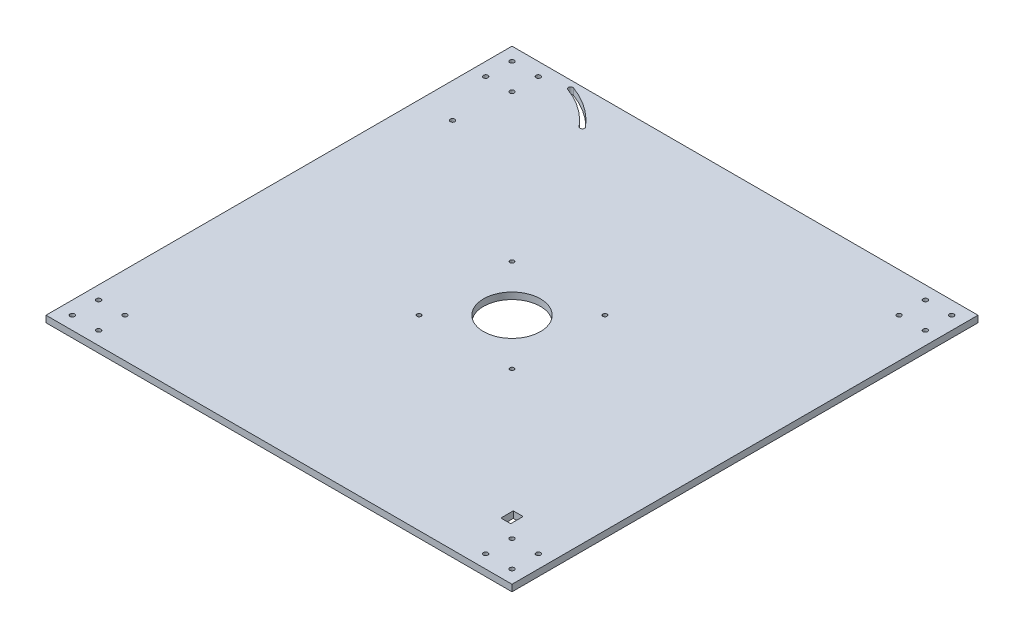
ISO-10303-21;
HEADER;
FILE_DESCRIPTION(('STEP AP214'),'2;1');
FILE_NAME('part.step','',(''),(''),'','','');
FILE_SCHEMA(('AUTOMOTIVE_DESIGN { 1 0 10303 214 1 1 1 1 }'));
ENDSEC;
DATA;
#1=APPLICATION_CONTEXT('core data for automotive mechanical design processes');
#2=APPLICATION_PROTOCOL_DEFINITION('international standard','automotive_design',2000,#1);
#3=PRODUCT_CONTEXT('',#1,'mechanical');
#4=PRODUCT('Part','Part','',(#3));
#5=PRODUCT_RELATED_PRODUCT_CATEGORY('part','',(#4));
#6=PRODUCT_DEFINITION_FORMATION('','',#4);
#7=PRODUCT_DEFINITION_CONTEXT('part definition',#1,'design');
#8=PRODUCT_DEFINITION('design','',#6,#7);
#9=PRODUCT_DEFINITION_SHAPE('','',#8);
#10=(LENGTH_UNIT() NAMED_UNIT(*) SI_UNIT(.MILLI.,.METRE.));
#11=(NAMED_UNIT(*) PLANE_ANGLE_UNIT() SI_UNIT($,.RADIAN.));
#12=(NAMED_UNIT(*) SI_UNIT($,.STERADIAN.) SOLID_ANGLE_UNIT());
#13=UNCERTAINTY_MEASURE_WITH_UNIT(LENGTH_MEASURE(1.E-05),#10,'distance_accuracy_value','');
#14=(GEOMETRIC_REPRESENTATION_CONTEXT(3) GLOBAL_UNCERTAINTY_ASSIGNED_CONTEXT((#13)) GLOBAL_UNIT_ASSIGNED_CONTEXT((#10,
#11,#12)) REPRESENTATION_CONTEXT('',''));
#15=CARTESIAN_POINT('',(0.,0.,0.));
#16=DIRECTION('',(0.,0.,1.));
#17=DIRECTION('',(1.,0.,0.));
#18=AXIS2_PLACEMENT_3D('',#15,#16,#17);
#19=CARTESIAN_POINT('',(224.79,6.35,224.79));
#20=DIRECTION('',(-1.,0.,0.));
#21=DIRECTION('',(0.,0.,1.));
#22=AXIS2_PLACEMENT_3D('',#19,#20,#21);
#23=PLANE('',#22);
#24=DIRECTION('',(0.,0.,-1.));
#25=VECTOR('',#24,1.);
#26=CARTESIAN_POINT('',(224.79,0.,224.79));
#27=LINE('',#26,#25);
#28=CARTESIAN_POINT('',(224.79,0.,224.79));
#29=VERTEX_POINT('',#28);
#30=CARTESIAN_POINT('',(224.79,0.,-224.79));
#31=VERTEX_POINT('',#30);
#32=EDGE_CURVE('E321',#29,#31,#27,.T.);
#33=ORIENTED_EDGE('',*,*,#32,.T.);
#34=DIRECTION('',(0.,-1.,0.));
#35=VECTOR('',#34,1.);
#36=CARTESIAN_POINT('',(224.79,6.35,-224.79));
#37=LINE('',#36,#35);
#38=CARTESIAN_POINT('',(224.79,6.35,-224.79));
#39=VERTEX_POINT('',#38);
#40=EDGE_CURVE('E11',#39,#31,#37,.T.);
#41=ORIENTED_EDGE('',*,*,#40,.F.);
#42=DIRECTION('',(0.,0.,-1.));
#43=VECTOR('',#42,1.);
#44=CARTESIAN_POINT('',(224.79,6.35,224.79));
#45=LINE('',#44,#43);
#46=CARTESIAN_POINT('',(224.79,6.35,224.79));
#47=VERTEX_POINT('',#46);
#48=EDGE_CURVE('E322',#47,#39,#45,.T.);
#49=ORIENTED_EDGE('',*,*,#48,.F.);
#50=DIRECTION('',(0.,-1.,0.));
#51=VECTOR('',#50,1.);
#52=CARTESIAN_POINT('',(224.79,6.35,224.79));
#53=LINE('',#52,#51);
#54=EDGE_CURVE('E332',#47,#29,#53,.T.);
#55=ORIENTED_EDGE('',*,*,#54,.T.);
#56=EDGE_LOOP('',(#33,#41,#49,#55));
#57=FACE_BOUND('',#56,.T.);
#58=ADVANCED_FACE('F33',(#57),#23,.F.);
#59=CARTESIAN_POINT('',(-224.79,6.35,-224.79));
#60=DIRECTION('',(0.,0.,1.));
#61=DIRECTION('',(1.,0.,0.));
#62=AXIS2_PLACEMENT_3D('',#59,#60,#61);
#63=PLANE('',#62);
#64=DIRECTION('',(-1.,0.,0.));
#65=VECTOR('',#64,1.);
#66=CARTESIAN_POINT('',(-224.79,0.,-224.79));
#67=LINE('',#66,#65);
#68=CARTESIAN_POINT('',(-224.79,0.,-224.79));
#69=VERTEX_POINT('',#68);
#70=EDGE_CURVE('E335',#31,#69,#67,.T.);
#71=ORIENTED_EDGE('',*,*,#70,.T.);
#72=DIRECTION('',(0.,-1.,0.));
#73=VECTOR('',#72,1.);
#74=CARTESIAN_POINT('',(-224.79,6.35,-224.79));
#75=LINE('',#74,#73);
#76=CARTESIAN_POINT('',(-224.79,6.35,-224.79));
#77=VERTEX_POINT('',#76);
#78=EDGE_CURVE('E40',#77,#69,#75,.T.);
#79=ORIENTED_EDGE('',*,*,#78,.F.);
#80=DIRECTION('',(-1.,0.,0.));
#81=VECTOR('',#80,1.);
#82=CARTESIAN_POINT('',(-224.79,6.35,-224.79));
#83=LINE('',#82,#81);
#84=EDGE_CURVE('E325',#39,#77,#83,.T.);
#85=ORIENTED_EDGE('',*,*,#84,.F.);
#86=ORIENTED_EDGE('',*,*,#40,.T.);
#87=EDGE_LOOP('',(#71,#79,#85,#86));
#88=FACE_BOUND('',#87,.T.);
#89=ADVANCED_FACE('F364',(#88),#63,.F.);
#90=CARTESIAN_POINT('',(-224.79,6.35,224.79));
#91=DIRECTION('',(1.,0.,0.));
#92=DIRECTION('',(0.,0.,-1.));
#93=AXIS2_PLACEMENT_3D('',#90,#91,#92);
#94=PLANE('',#93);
#95=DIRECTION('',(0.,0.,1.));
#96=VECTOR('',#95,1.);
#97=CARTESIAN_POINT('',(-224.79,0.,224.79));
#98=LINE('',#97,#96);
#99=CARTESIAN_POINT('',(-224.79,0.,224.79));
#100=VERTEX_POINT('',#99);
#101=EDGE_CURVE('E337',#69,#100,#98,.T.);
#102=ORIENTED_EDGE('',*,*,#101,.T.);
#103=DIRECTION('',(0.,-1.,0.));
#104=VECTOR('',#103,1.);
#105=CARTESIAN_POINT('',(-224.79,6.35,224.79));
#106=LINE('',#105,#104);
#107=CARTESIAN_POINT('',(-224.79,6.35,224.79));
#108=VERTEX_POINT('',#107);
#109=EDGE_CURVE('E342',#108,#100,#106,.T.);
#110=ORIENTED_EDGE('',*,*,#109,.F.);
#111=DIRECTION('',(0.,0.,1.));
#112=VECTOR('',#111,1.);
#113=CARTESIAN_POINT('',(-224.79,6.35,224.79));
#114=LINE('',#113,#112);
#115=EDGE_CURVE('E328',#77,#108,#114,.T.);
#116=ORIENTED_EDGE('',*,*,#115,.F.);
#117=ORIENTED_EDGE('',*,*,#78,.T.);
#118=EDGE_LOOP('',(#102,#110,#116,#117));
#119=FACE_BOUND('',#118,.T.);
#120=ADVANCED_FACE('F349',(#119),#94,.F.);
#121=CARTESIAN_POINT('',(-224.79,6.35,224.79));
#122=DIRECTION('',(0.,0.,-1.));
#123=DIRECTION('',(-1.,0.,0.));
#124=AXIS2_PLACEMENT_3D('',#121,#122,#123);
#125=PLANE('',#124);
#126=DIRECTION('',(1.,0.,0.));
#127=VECTOR('',#126,1.);
#128=CARTESIAN_POINT('',(-224.79,0.,224.79));
#129=LINE('',#128,#127);
#130=EDGE_CURVE('E326',#100,#29,#129,.T.);
#131=ORIENTED_EDGE('',*,*,#130,.T.);
#132=ORIENTED_EDGE('',*,*,#54,.F.);
#133=DIRECTION('',(1.,0.,0.));
#134=VECTOR('',#133,1.);
#135=CARTESIAN_POINT('',(-224.79,6.35,224.79));
#136=LINE('',#135,#134);
#137=EDGE_CURVE('E330',#108,#47,#136,.T.);
#138=ORIENTED_EDGE('',*,*,#137,.F.);
#139=ORIENTED_EDGE('',*,*,#109,.T.);
#140=EDGE_LOOP('',(#131,#132,#138,#139));
#141=FACE_BOUND('',#140,.T.);
#142=ADVANCED_FACE('F357',(#141),#125,.F.);
#143=CARTESIAN_POINT('',(0.,6.35,0.));
#144=DIRECTION('',(0.,-1.,0.));
#145=DIRECTION('',(0.,0.,-1.));
#146=AXIS2_PLACEMENT_3D('',#143,#144,#145);
#147=PLANE('',#146);
#148=CARTESIAN_POINT('',(-191.419449709452,6.35,-134.033341646512));
#149=DIRECTION('',(0.,1.,0.));
#150=DIRECTION('',(0.,0.,1.));
#151=AXIS2_PLACEMENT_3D('',#148,#149,#150);
#152=CIRCLE('',#151,91.0828125);
#153=CARTESIAN_POINT('',(-121.645967330179,6.35,-192.580244976915));
#154=VERTEX_POINT('',#153);
#155=CARTESIAN_POINT('',(-160.267293123698,6.35,-219.623188433189));
#156=VERTEX_POINT('',#155);
#157=EDGE_CURVE('E148',#154,#156,#152,.T.);
#158=ORIENTED_EDGE('',*,*,#157,.F.);
#159=CARTESIAN_POINT('',(-123.318098716175,6.35,-191.177160147646));
#160=DIRECTION('',(0.,1.,0.));
#161=DIRECTION('',(0.,0.,1.));
#162=AXIS2_PLACEMENT_3D('',#159,#160,#161);
#163=CIRCLE('',#162,2.1828125);
#164=CARTESIAN_POINT('',(-124.990230102171,6.35,-189.774075318377));
#165=VERTEX_POINT('',#164);
#166=EDGE_CURVE('E47',#165,#154,#163,.T.);
#167=ORIENTED_EDGE('',*,*,#166,.F.);
#168=CARTESIAN_POINT('',(-191.419449709452,6.35,-134.033341646512));
#169=DIRECTION('',(0.,-1.,0.));
#170=DIRECTION('',(0.,0.,1.));
#171=AXIS2_PLACEMENT_3D('',#168,#169,#170);
#172=CIRCLE('',#171,86.7171875);
#173=CARTESIAN_POINT('',(-161.760424811904,6.35,-215.52084283557));
#174=VERTEX_POINT('',#173);
#175=EDGE_CURVE('E139',#174,#165,#172,.T.);
#176=ORIENTED_EDGE('',*,*,#175,.F.);
#177=CARTESIAN_POINT('',(-161.013858967801,6.35,-217.572015634379));
#178=DIRECTION('',(0.,1.,0.));
#179=DIRECTION('',(0.,0.,1.));
#180=AXIS2_PLACEMENT_3D('',#177,#178,#179);
#181=CIRCLE('',#180,2.18281250000003);
#182=EDGE_CURVE('E142',#156,#174,#181,.T.);
#183=ORIENTED_EDGE('',*,*,#182,.F.);
#184=EDGE_LOOP('',(#158,#167,#176,#183));
#185=FACE_BOUND('',#184,.T.);
#186=CARTESIAN_POINT('',(-191.419449709452,6.35,-134.033341646512));
#187=DIRECTION('',(0.,1.,0.));
#188=DIRECTION('',(0.,0.,1.));
#189=AXIS2_PLACEMENT_3D('',#186,#187,#188);
#190=CIRCLE('',#189,2.18281250000003);
#191=CARTESIAN_POINT('',(-191.419449709452,6.35,-131.850529146512));
#192=VERTEX_POINT('',#191);
#193=EDGE_CURVE('E154',#192,#192,#190,.T.);
#194=ORIENTED_EDGE('',*,*,#193,.F.);
#195=EDGE_LOOP('',(#194));
#196=FACE_BOUND('',#195,.T.);
#197=CARTESIAN_POINT('',(212.09,6.35,-212.09));
#198=DIRECTION('',(0.,1.,0.));
#199=DIRECTION('',(0.,0.,1.));
#200=AXIS2_PLACEMENT_3D('',#197,#198,#199);
#201=CIRCLE('',#200,2.1828125);
#202=CARTESIAN_POINT('',(212.09,6.35,-209.9071875));
#203=VERTEX_POINT('',#202);
#204=EDGE_CURVE('E186',#203,#203,#201,.T.);
#205=ORIENTED_EDGE('',*,*,#204,.F.);
#206=EDGE_LOOP('',(#205));
#207=FACE_BOUND('',#206,.T.);
#208=CARTESIAN_POINT('',(-212.09,6.35,-212.09));
#209=DIRECTION('',(0.,1.,0.));
#210=DIRECTION('',(0.,0.,1.));
#211=AXIS2_PLACEMENT_3D('',#208,#209,#210);
#212=CIRCLE('',#211,2.1828125);
#213=CARTESIAN_POINT('',(-212.09,6.35,-209.9071875));
#214=VERTEX_POINT('',#213);
#215=EDGE_CURVE('E180',#214,#214,#212,.T.);
#216=ORIENTED_EDGE('',*,*,#215,.F.);
#217=EDGE_LOOP('',(#216));
#218=FACE_BOUND('',#217,.T.);
#219=CARTESIAN_POINT('',(212.09,6.35,-186.69));
#220=DIRECTION('',(0.,1.,0.));
#221=DIRECTION('',(0.,0.,1.));
#222=AXIS2_PLACEMENT_3D('',#219,#220,#221);
#223=CIRCLE('',#222,2.1828125);
#224=CARTESIAN_POINT('',(212.09,6.35,-184.5071875));
#225=VERTEX_POINT('',#224);
#226=EDGE_CURVE('E174',#225,#225,#223,.T.);
#227=ORIENTED_EDGE('',*,*,#226,.F.);
#228=EDGE_LOOP('',(#227));
#229=FACE_BOUND('',#228,.T.);
#230=CARTESIAN_POINT('',(186.69,6.35,-186.69));
#231=DIRECTION('',(0.,1.,0.));
#232=DIRECTION('',(0.,0.,1.));
#233=AXIS2_PLACEMENT_3D('',#230,#231,#232);
#234=CIRCLE('',#233,2.1828125);
#235=CARTESIAN_POINT('',(186.69,6.35,-184.5071875));
#236=VERTEX_POINT('',#235);
#237=EDGE_CURVE('E168',#236,#236,#234,.T.);
#238=ORIENTED_EDGE('',*,*,#237,.F.);
#239=EDGE_LOOP('',(#238));
#240=FACE_BOUND('',#239,.T.);
#241=CARTESIAN_POINT('',(186.69,6.35,-212.09));
#242=DIRECTION('',(0.,1.,0.));
#243=DIRECTION('',(0.,0.,1.));
#244=AXIS2_PLACEMENT_3D('',#241,#242,#243);
#245=CIRCLE('',#244,2.1828125);
#246=CARTESIAN_POINT('',(186.69,6.35,-209.9071875));
#247=VERTEX_POINT('',#246);
#248=EDGE_CURVE('E167',#247,#247,#245,.T.);
#249=ORIENTED_EDGE('',*,*,#248,.F.);
#250=EDGE_LOOP('',(#249));
#251=FACE_BOUND('',#250,.T.);
#252=CARTESIAN_POINT('',(-186.69,6.35,-186.69));
#253=DIRECTION('',(0.,1.,0.));
#254=DIRECTION('',(0.,0.,1.));
#255=AXIS2_PLACEMENT_3D('',#252,#253,#254);
#256=CIRCLE('',#255,2.1828125);
#257=CARTESIAN_POINT('',(-186.69,6.35,-184.5071875));
#258=VERTEX_POINT('',#257);
#259=EDGE_CURVE('E200',#258,#258,#256,.T.);
#260=ORIENTED_EDGE('',*,*,#259,.F.);
#261=EDGE_LOOP('',(#260));
#262=FACE_BOUND('',#261,.T.);
#263=CARTESIAN_POINT('',(-212.09,6.35,-186.69));
#264=DIRECTION('',(0.,1.,0.));
#265=DIRECTION('',(0.,0.,1.));
#266=AXIS2_PLACEMENT_3D('',#263,#264,#265);
#267=CIRCLE('',#266,2.1828125);
#268=CARTESIAN_POINT('',(-212.09,6.35,-184.5071875));
#269=VERTEX_POINT('',#268);
#270=EDGE_CURVE('E194',#269,#269,#267,.T.);
#271=ORIENTED_EDGE('',*,*,#270,.F.);
#272=EDGE_LOOP('',(#271));
#273=FACE_BOUND('',#272,.T.);
#274=CARTESIAN_POINT('',(186.69,6.35,186.69));
#275=DIRECTION('',(0.,1.,0.));
#276=DIRECTION('',(0.,0.,1.));
#277=AXIS2_PLACEMENT_3D('',#274,#275,#276);
#278=CIRCLE('',#277,2.1828125);
#279=CARTESIAN_POINT('',(186.69,6.35,188.8728125));
#280=VERTEX_POINT('',#279);
#281=EDGE_CURVE('E210',#280,#280,#278,.T.);
#282=ORIENTED_EDGE('',*,*,#281,.F.);
#283=EDGE_LOOP('',(#282));
#284=FACE_BOUND('',#283,.T.);
#285=CARTESIAN_POINT('',(212.09,6.35,186.69));
#286=DIRECTION('',(0.,1.,0.));
#287=DIRECTION('',(0.,0.,1.));
#288=AXIS2_PLACEMENT_3D('',#285,#286,#287);
#289=CIRCLE('',#288,2.1828125);
#290=CARTESIAN_POINT('',(212.09,6.35,188.8728125));
#291=VERTEX_POINT('',#290);
#292=EDGE_CURVE('E216',#291,#291,#289,.T.);
#293=ORIENTED_EDGE('',*,*,#292,.F.);
#294=EDGE_LOOP('',(#293));
#295=FACE_BOUND('',#294,.T.);
#296=CARTESIAN_POINT('',(212.09,6.35,212.09));
#297=DIRECTION('',(0.,1.,0.));
#298=DIRECTION('',(0.,0.,1.));
#299=AXIS2_PLACEMENT_3D('',#296,#297,#298);
#300=CIRCLE('',#299,2.1828125);
#301=CARTESIAN_POINT('',(212.09,6.35,214.2728125));
#302=VERTEX_POINT('',#301);
#303=EDGE_CURVE('E222',#302,#302,#300,.T.);
#304=ORIENTED_EDGE('',*,*,#303,.F.);
#305=EDGE_LOOP('',(#304));
#306=FACE_BOUND('',#305,.T.);
#307=CARTESIAN_POINT('',(186.69,6.35,212.09));
#308=DIRECTION('',(0.,1.,0.));
#309=DIRECTION('',(0.,0.,1.));
#310=AXIS2_PLACEMENT_3D('',#307,#308,#309);
#311=CIRCLE('',#310,2.1828125);
#312=CARTESIAN_POINT('',(186.69,6.35,214.2728125));
#313=VERTEX_POINT('',#312);
#314=EDGE_CURVE('E228',#313,#313,#311,.T.);
#315=ORIENTED_EDGE('',*,*,#314,.F.);
#316=EDGE_LOOP('',(#315));
#317=FACE_BOUND('',#316,.T.);
#318=CARTESIAN_POINT('',(-212.09,6.35,186.69));
#319=DIRECTION('',(0.,1.,0.));
#320=DIRECTION('',(0.,0.,1.));
#321=AXIS2_PLACEMENT_3D('',#318,#319,#320);
#322=CIRCLE('',#321,2.1828125);
#323=CARTESIAN_POINT('',(-212.09,6.35,188.8728125));
#324=VERTEX_POINT('',#323);
#325=EDGE_CURVE('E234',#324,#324,#322,.T.);
#326=ORIENTED_EDGE('',*,*,#325,.F.);
#327=EDGE_LOOP('',(#326));
#328=FACE_BOUND('',#327,.T.);
#329=CARTESIAN_POINT('',(-186.69,6.35,186.69));
#330=DIRECTION('',(0.,1.,0.));
#331=DIRECTION('',(0.,0.,1.));
#332=AXIS2_PLACEMENT_3D('',#329,#330,#331);
#333=CIRCLE('',#332,2.1828125);
#334=CARTESIAN_POINT('',(-186.69,6.35,188.8728125));
#335=VERTEX_POINT('',#334);
#336=EDGE_CURVE('E240',#335,#335,#333,.T.);
#337=ORIENTED_EDGE('',*,*,#336,.F.);
#338=EDGE_LOOP('',(#337));
#339=FACE_BOUND('',#338,.T.);
#340=CARTESIAN_POINT('',(-186.69,6.35,212.09));
#341=DIRECTION('',(0.,1.,0.));
#342=DIRECTION('',(0.,0.,1.));
#343=AXIS2_PLACEMENT_3D('',#340,#341,#342);
#344=CIRCLE('',#343,2.1828125);
#345=CARTESIAN_POINT('',(-186.69,6.35,214.2728125));
#346=VERTEX_POINT('',#345);
#347=EDGE_CURVE('E246',#346,#346,#344,.T.);
#348=ORIENTED_EDGE('',*,*,#347,.F.);
#349=EDGE_LOOP('',(#348));
#350=FACE_BOUND('',#349,.T.);
#351=CARTESIAN_POINT('',(-212.09,6.35,212.09));
#352=DIRECTION('',(0.,1.,0.));
#353=DIRECTION('',(0.,0.,1.));
#354=AXIS2_PLACEMENT_3D('',#351,#352,#353);
#355=CIRCLE('',#354,2.1828125);
#356=CARTESIAN_POINT('',(-212.09,6.35,214.2728125));
#357=VERTEX_POINT('',#356);
#358=EDGE_CURVE('E161',#357,#357,#355,.T.);
#359=ORIENTED_EDGE('',*,*,#358,.F.);
#360=EDGE_LOOP('',(#359));
#361=FACE_BOUND('',#360,.T.);
#362=CARTESIAN_POINT('',(-186.69,6.35,-212.09));
#363=DIRECTION('',(0.,1.,0.));
#364=DIRECTION('',(0.,0.,1.));
#365=AXIS2_PLACEMENT_3D('',#362,#363,#364);
#366=CIRCLE('',#365,2.1828125);
#367=CARTESIAN_POINT('',(-186.69,6.35,-209.9071875));
#368=VERTEX_POINT('',#367);
#369=EDGE_CURVE('E193',#368,#368,#366,.T.);
#370=ORIENTED_EDGE('',*,*,#369,.F.);
#371=EDGE_LOOP('',(#370));
#372=FACE_BOUND('',#371,.T.);
#373=DIRECTION('',(-1.,0.,0.));
#374=VECTOR('',#373,1.);
#375=CARTESIAN_POINT('',(164.0788150761,6.35,162.8288150761));
#376=LINE('',#375,#374);
#377=CARTESIAN_POINT('',(173.5788150761,6.35,162.8288150761));
#378=VERTEX_POINT('',#377);
#379=CARTESIAN_POINT('',(164.0788150761,6.35,162.8288150761));
#380=VERTEX_POINT('',#379);
#381=EDGE_CURVE('E275',#378,#380,#376,.T.);
#382=ORIENTED_EDGE('',*,*,#381,.F.);
#383=DIRECTION('',(0.,0.,-1.));
#384=VECTOR('',#383,1.);
#385=CARTESIAN_POINT('',(173.5788150761,6.35,174.8288150761));
#386=LINE('',#385,#384);
#387=CARTESIAN_POINT('',(173.5788150761,6.35,174.8288150761));
#388=VERTEX_POINT('',#387);
#389=EDGE_CURVE('E257',#388,#378,#386,.T.);
#390=ORIENTED_EDGE('',*,*,#389,.F.);
#391=DIRECTION('',(1.,0.,0.));
#392=VECTOR('',#391,1.);
#393=CARTESIAN_POINT('',(164.0788150761,6.35,174.8288150761));
#394=LINE('',#393,#392);
#395=CARTESIAN_POINT('',(164.0788150761,6.35,174.8288150761));
#396=VERTEX_POINT('',#395);
#397=EDGE_CURVE('E264',#396,#388,#394,.T.);
#398=ORIENTED_EDGE('',*,*,#397,.F.);
#399=DIRECTION('',(0.,0.,1.));
#400=VECTOR('',#399,1.);
#401=CARTESIAN_POINT('',(164.0788150761,6.35,174.8288150761));
#402=LINE('',#401,#400);
#403=EDGE_CURVE('E278',#380,#396,#402,.T.);
#404=ORIENTED_EDGE('',*,*,#403,.F.);
#405=EDGE_LOOP('',(#382,#390,#398,#404));
#406=FACE_BOUND('',#405,.T.);
#407=CARTESIAN_POINT('',(0.,6.35,0.));
#408=DIRECTION('',(0.,-1.,0.));
#409=DIRECTION('',(0.,0.,-1.));
#410=AXIS2_PLACEMENT_3D('',#407,#408,#409);
#411=CIRCLE('',#410,27.432);
#412=CARTESIAN_POINT('',(0.,6.35,-27.432));
#413=VERTEX_POINT('',#412);
#414=EDGE_CURVE('E312',#413,#413,#411,.T.);
#415=ORIENTED_EDGE('',*,*,#414,.T.);
#416=EDGE_LOOP('',(#415));
#417=FACE_BOUND('',#416,.T.);
#418=CARTESIAN_POINT('',(44.8437,6.35,44.8437));
#419=DIRECTION('',(0.,-1.,0.));
#420=DIRECTION('',(0.,0.,-1.));
#421=AXIS2_PLACEMENT_3D('',#418,#419,#420);
#422=CIRCLE('',#421,1.98437499999999);
#423=CARTESIAN_POINT('',(44.8437,6.35,42.859325));
#424=VERTEX_POINT('',#423);
#425=EDGE_CURVE('E309',#424,#424,#422,.T.);
#426=ORIENTED_EDGE('',*,*,#425,.T.);
#427=EDGE_LOOP('',(#426));
#428=FACE_BOUND('',#427,.T.);
#429=CARTESIAN_POINT('',(44.8437,6.35,-44.8437));
#430=DIRECTION('',(0.,-1.,0.));
#431=DIRECTION('',(0.,0.,-1.));
#432=AXIS2_PLACEMENT_3D('',#429,#430,#431);
#433=CIRCLE('',#432,1.98437499999999);
#434=CARTESIAN_POINT('',(44.8437,6.35,-46.828075));
#435=VERTEX_POINT('',#434);
#436=EDGE_CURVE('E306',#435,#435,#433,.T.);
#437=ORIENTED_EDGE('',*,*,#436,.T.);
#438=EDGE_LOOP('',(#437));
#439=FACE_BOUND('',#438,.T.);
#440=CARTESIAN_POINT('',(-44.8437,6.35,44.8437));
#441=DIRECTION('',(0.,-1.,0.));
#442=DIRECTION('',(0.,0.,-1.));
#443=AXIS2_PLACEMENT_3D('',#440,#441,#442);
#444=CIRCLE('',#443,1.98437499999999);
#445=CARTESIAN_POINT('',(-44.8437,6.35,42.859325));
#446=VERTEX_POINT('',#445);
#447=EDGE_CURVE('E301',#446,#446,#444,.T.);
#448=ORIENTED_EDGE('',*,*,#447,.T.);
#449=EDGE_LOOP('',(#448));
#450=FACE_BOUND('',#449,.T.);
#451=CARTESIAN_POINT('',(-44.8437,6.35,-44.8437));
#452=DIRECTION('',(0.,-1.,0.));
#453=DIRECTION('',(0.,0.,-1.));
#454=AXIS2_PLACEMENT_3D('',#451,#452,#453);
#455=CIRCLE('',#454,1.98437499999999);
#456=CARTESIAN_POINT('',(-44.8437,6.35,-46.828075));
#457=VERTEX_POINT('',#456);
#458=EDGE_CURVE('E318',#457,#457,#455,.T.);
#459=ORIENTED_EDGE('',*,*,#458,.T.);
#460=EDGE_LOOP('',(#459));
#461=FACE_BOUND('',#460,.T.);
#462=ORIENTED_EDGE('',*,*,#48,.T.);
#463=ORIENTED_EDGE('',*,*,#84,.T.);
#464=ORIENTED_EDGE('',*,*,#115,.T.);
#465=ORIENTED_EDGE('',*,*,#137,.T.);
#466=EDGE_LOOP('',(#462,#463,#464,#465));
#467=FACE_BOUND('',#466,.T.);
#468=ADVANCED_FACE('F363',(#185,#196,#207,#218,#229,#240,#251,#262,#273,#284,#295,#306,#317,
#328,#339,#350,#361,#372,#406,#417,#428,#439,#450,#461,#467),#147,.F.);
#469=CARTESIAN_POINT('',(0.,0.,0.));
#470=DIRECTION('',(0.,-1.,0.));
#471=DIRECTION('',(0.,0.,-1.));
#472=AXIS2_PLACEMENT_3D('',#469,#470,#471);
#473=PLANE('',#472);
#474=CARTESIAN_POINT('',(-123.318098716175,0.,-191.177160147646));
#475=DIRECTION('',(0.,1.,0.));
#476=DIRECTION('',(0.,0.,1.));
#477=AXIS2_PLACEMENT_3D('',#474,#475,#476);
#478=CIRCLE('',#477,2.1828125);
#479=CARTESIAN_POINT('',(-124.990230102171,0.,-189.774075318377));
#480=VERTEX_POINT('',#479);
#481=CARTESIAN_POINT('',(-121.645967330179,0.,-192.580244976915));
#482=VERTEX_POINT('',#481);
#483=EDGE_CURVE('E123',#480,#482,#478,.T.);
#484=ORIENTED_EDGE('',*,*,#483,.T.);
#485=CARTESIAN_POINT('',(-191.419449709452,0.,-134.033341646512));
#486=DIRECTION('',(0.,1.,0.));
#487=DIRECTION('',(0.,0.,1.));
#488=AXIS2_PLACEMENT_3D('',#485,#486,#487);
#489=CIRCLE('',#488,91.0828125);
#490=CARTESIAN_POINT('',(-160.267293123698,0.,-219.623188433189));
#491=VERTEX_POINT('',#490);
#492=EDGE_CURVE('E132',#482,#491,#489,.T.);
#493=ORIENTED_EDGE('',*,*,#492,.T.);
#494=CARTESIAN_POINT('',(-161.013858967801,0.,-217.572015634379));
#495=DIRECTION('',(0.,1.,0.));
#496=DIRECTION('',(0.,0.,1.));
#497=AXIS2_PLACEMENT_3D('',#494,#495,#496);
#498=CIRCLE('',#497,2.18281250000003);
#499=CARTESIAN_POINT('',(-161.760424811904,0.,-215.52084283557));
#500=VERTEX_POINT('',#499);
#501=EDGE_CURVE('E55',#491,#500,#498,.T.);
#502=ORIENTED_EDGE('',*,*,#501,.T.);
#503=CARTESIAN_POINT('',(-191.419449709452,0.,-134.033341646512));
#504=DIRECTION('',(0.,-1.,0.));
#505=DIRECTION('',(0.,0.,1.));
#506=AXIS2_PLACEMENT_3D('',#503,#504,#505);
#507=CIRCLE('',#506,86.7171875);
#508=EDGE_CURVE('E129',#500,#480,#507,.T.);
#509=ORIENTED_EDGE('',*,*,#508,.T.);
#510=EDGE_LOOP('',(#484,#493,#502,#509));
#511=FACE_BOUND('',#510,.T.);
#512=CARTESIAN_POINT('',(-191.419449709452,0.,-134.033341646512));
#513=DIRECTION('',(0.,1.,0.));
#514=DIRECTION('',(0.,0.,1.));
#515=AXIS2_PLACEMENT_3D('',#512,#513,#514);
#516=CIRCLE('',#515,2.18281250000003);
#517=CARTESIAN_POINT('',(-191.419449709452,0.,-131.850529146512));
#518=VERTEX_POINT('',#517);
#519=EDGE_CURVE('E158',#518,#518,#516,.T.);
#520=ORIENTED_EDGE('',*,*,#519,.T.);
#521=EDGE_LOOP('',(#520));
#522=FACE_BOUND('',#521,.T.);
#523=CARTESIAN_POINT('',(212.09,0.,-212.09));
#524=DIRECTION('',(0.,1.,0.));
#525=DIRECTION('',(0.,0.,1.));
#526=AXIS2_PLACEMENT_3D('',#523,#524,#525);
#527=CIRCLE('',#526,2.1828125);
#528=CARTESIAN_POINT('',(212.09,0.,-209.9071875));
#529=VERTEX_POINT('',#528);
#530=EDGE_CURVE('E183',#529,#529,#527,.T.);
#531=ORIENTED_EDGE('',*,*,#530,.T.);
#532=EDGE_LOOP('',(#531));
#533=FACE_BOUND('',#532,.T.);
#534=CARTESIAN_POINT('',(-212.09,0.,-212.09));
#535=DIRECTION('',(0.,1.,0.));
#536=DIRECTION('',(0.,0.,1.));
#537=AXIS2_PLACEMENT_3D('',#534,#535,#536);
#538=CIRCLE('',#537,2.1828125);
#539=CARTESIAN_POINT('',(-212.09,0.,-209.9071875));
#540=VERTEX_POINT('',#539);
#541=EDGE_CURVE('E177',#540,#540,#538,.T.);
#542=ORIENTED_EDGE('',*,*,#541,.T.);
#543=EDGE_LOOP('',(#542));
#544=FACE_BOUND('',#543,.T.);
#545=CARTESIAN_POINT('',(212.09,0.,-186.69));
#546=DIRECTION('',(0.,1.,0.));
#547=DIRECTION('',(0.,0.,1.));
#548=AXIS2_PLACEMENT_3D('',#545,#546,#547);
#549=CIRCLE('',#548,2.1828125);
#550=CARTESIAN_POINT('',(212.09,0.,-184.5071875));
#551=VERTEX_POINT('',#550);
#552=EDGE_CURVE('E171',#551,#551,#549,.T.);
#553=ORIENTED_EDGE('',*,*,#552,.T.);
#554=EDGE_LOOP('',(#553));
#555=FACE_BOUND('',#554,.T.);
#556=CARTESIAN_POINT('',(186.69,0.,-186.69));
#557=DIRECTION('',(0.,1.,0.));
#558=DIRECTION('',(0.,0.,1.));
#559=AXIS2_PLACEMENT_3D('',#556,#557,#558);
#560=CIRCLE('',#559,2.1828125);
#561=CARTESIAN_POINT('',(186.69,0.,-184.5071875));
#562=VERTEX_POINT('',#561);
#563=EDGE_CURVE('E164',#562,#562,#560,.T.);
#564=ORIENTED_EDGE('',*,*,#563,.T.);
#565=EDGE_LOOP('',(#564));
#566=FACE_BOUND('',#565,.T.);
#567=CARTESIAN_POINT('',(186.69,0.,-212.09));
#568=DIRECTION('',(0.,1.,0.));
#569=DIRECTION('',(0.,0.,1.));
#570=AXIS2_PLACEMENT_3D('',#567,#568,#569);
#571=CIRCLE('',#570,2.1828125);
#572=CARTESIAN_POINT('',(186.69,0.,-209.9071875));
#573=VERTEX_POINT('',#572);
#574=EDGE_CURVE('E203',#573,#573,#571,.T.);
#575=ORIENTED_EDGE('',*,*,#574,.T.);
#576=EDGE_LOOP('',(#575));
#577=FACE_BOUND('',#576,.T.);
#578=CARTESIAN_POINT('',(-186.69,0.,-186.69));
#579=DIRECTION('',(0.,1.,0.));
#580=DIRECTION('',(0.,0.,1.));
#581=AXIS2_PLACEMENT_3D('',#578,#579,#580);
#582=CIRCLE('',#581,2.1828125);
#583=CARTESIAN_POINT('',(-186.69,0.,-184.5071875));
#584=VERTEX_POINT('',#583);
#585=EDGE_CURVE('E197',#584,#584,#582,.T.);
#586=ORIENTED_EDGE('',*,*,#585,.T.);
#587=EDGE_LOOP('',(#586));
#588=FACE_BOUND('',#587,.T.);
#589=CARTESIAN_POINT('',(-212.09,0.,-186.69));
#590=DIRECTION('',(0.,1.,0.));
#591=DIRECTION('',(0.,0.,1.));
#592=AXIS2_PLACEMENT_3D('',#589,#590,#591);
#593=CIRCLE('',#592,2.1828125);
#594=CARTESIAN_POINT('',(-212.09,0.,-184.5071875));
#595=VERTEX_POINT('',#594);
#596=EDGE_CURVE('E190',#595,#595,#593,.T.);
#597=ORIENTED_EDGE('',*,*,#596,.T.);
#598=EDGE_LOOP('',(#597));
#599=FACE_BOUND('',#598,.T.);
#600=CARTESIAN_POINT('',(186.69,0.,186.69));
#601=DIRECTION('',(0.,1.,0.));
#602=DIRECTION('',(0.,0.,1.));
#603=AXIS2_PLACEMENT_3D('',#600,#601,#602);
#604=CIRCLE('',#603,2.1828125);
#605=CARTESIAN_POINT('',(186.69,0.,188.8728125));
#606=VERTEX_POINT('',#605);
#607=EDGE_CURVE('E189',#606,#606,#604,.T.);
#608=ORIENTED_EDGE('',*,*,#607,.T.);
#609=EDGE_LOOP('',(#608));
#610=FACE_BOUND('',#609,.T.);
#611=CARTESIAN_POINT('',(212.09,0.,186.69));
#612=DIRECTION('',(0.,1.,0.));
#613=DIRECTION('',(0.,0.,1.));
#614=AXIS2_PLACEMENT_3D('',#611,#612,#613);
#615=CIRCLE('',#614,2.1828125);
#616=CARTESIAN_POINT('',(212.09,0.,188.8728125));
#617=VERTEX_POINT('',#616);
#618=EDGE_CURVE('E213',#617,#617,#615,.T.);
#619=ORIENTED_EDGE('',*,*,#618,.T.);
#620=EDGE_LOOP('',(#619));
#621=FACE_BOUND('',#620,.T.);
#622=CARTESIAN_POINT('',(212.09,0.,212.09));
#623=DIRECTION('',(0.,1.,0.));
#624=DIRECTION('',(0.,0.,1.));
#625=AXIS2_PLACEMENT_3D('',#622,#623,#624);
#626=CIRCLE('',#625,2.1828125);
#627=CARTESIAN_POINT('',(212.09,0.,214.2728125));
#628=VERTEX_POINT('',#627);
#629=EDGE_CURVE('E219',#628,#628,#626,.T.);
#630=ORIENTED_EDGE('',*,*,#629,.T.);
#631=EDGE_LOOP('',(#630));
#632=FACE_BOUND('',#631,.T.);
#633=CARTESIAN_POINT('',(186.69,0.,212.09));
#634=DIRECTION('',(0.,1.,0.));
#635=DIRECTION('',(0.,0.,1.));
#636=AXIS2_PLACEMENT_3D('',#633,#634,#635);
#637=CIRCLE('',#636,2.1828125);
#638=CARTESIAN_POINT('',(186.69,0.,214.2728125));
#639=VERTEX_POINT('',#638);
#640=EDGE_CURVE('E225',#639,#639,#637,.T.);
#641=ORIENTED_EDGE('',*,*,#640,.T.);
#642=EDGE_LOOP('',(#641));
#643=FACE_BOUND('',#642,.T.);
#644=CARTESIAN_POINT('',(-212.09,0.,186.69));
#645=DIRECTION('',(0.,1.,0.));
#646=DIRECTION('',(0.,0.,1.));
#647=AXIS2_PLACEMENT_3D('',#644,#645,#646);
#648=CIRCLE('',#647,2.1828125);
#649=CARTESIAN_POINT('',(-212.09,0.,188.8728125));
#650=VERTEX_POINT('',#649);
#651=EDGE_CURVE('E231',#650,#650,#648,.T.);
#652=ORIENTED_EDGE('',*,*,#651,.T.);
#653=EDGE_LOOP('',(#652));
#654=FACE_BOUND('',#653,.T.);
#655=CARTESIAN_POINT('',(-186.69,0.,186.69));
#656=DIRECTION('',(0.,1.,0.));
#657=DIRECTION('',(0.,0.,1.));
#658=AXIS2_PLACEMENT_3D('',#655,#656,#657);
#659=CIRCLE('',#658,2.1828125);
#660=CARTESIAN_POINT('',(-186.69,0.,188.8728125));
#661=VERTEX_POINT('',#660);
#662=EDGE_CURVE('E237',#661,#661,#659,.T.);
#663=ORIENTED_EDGE('',*,*,#662,.T.);
#664=EDGE_LOOP('',(#663));
#665=FACE_BOUND('',#664,.T.);
#666=CARTESIAN_POINT('',(-186.69,0.,212.09));
#667=DIRECTION('',(0.,1.,0.));
#668=DIRECTION('',(0.,0.,1.));
#669=AXIS2_PLACEMENT_3D('',#666,#667,#668);
#670=CIRCLE('',#669,2.1828125);
#671=CARTESIAN_POINT('',(-186.69,0.,214.2728125));
#672=VERTEX_POINT('',#671);
#673=EDGE_CURVE('E243',#672,#672,#670,.T.);
#674=ORIENTED_EDGE('',*,*,#673,.T.);
#675=EDGE_LOOP('',(#674));
#676=FACE_BOUND('',#675,.T.);
#677=CARTESIAN_POINT('',(-212.09,0.,212.09));
#678=DIRECTION('',(0.,1.,0.));
#679=DIRECTION('',(0.,0.,1.));
#680=AXIS2_PLACEMENT_3D('',#677,#678,#679);
#681=CIRCLE('',#680,2.1828125);
#682=CARTESIAN_POINT('',(-212.09,0.,214.2728125));
#683=VERTEX_POINT('',#682);
#684=EDGE_CURVE('E249',#683,#683,#681,.T.);
#685=ORIENTED_EDGE('',*,*,#684,.T.);
#686=EDGE_LOOP('',(#685));
#687=FACE_BOUND('',#686,.T.);
#688=CARTESIAN_POINT('',(-186.69,0.,-212.09));
#689=DIRECTION('',(0.,1.,0.));
#690=DIRECTION('',(0.,0.,1.));
#691=AXIS2_PLACEMENT_3D('',#688,#689,#690);
#692=CIRCLE('',#691,2.1828125);
#693=CARTESIAN_POINT('',(-186.69,0.,-209.9071875));
#694=VERTEX_POINT('',#693);
#695=EDGE_CURVE('E254',#694,#694,#692,.T.);
#696=ORIENTED_EDGE('',*,*,#695,.T.);
#697=EDGE_LOOP('',(#696));
#698=FACE_BOUND('',#697,.T.);
#699=DIRECTION('',(0.,0.,-1.));
#700=VECTOR('',#699,1.);
#701=CARTESIAN_POINT('',(173.5788150761,0.,174.8288150761));
#702=LINE('',#701,#700);
#703=CARTESIAN_POINT('',(173.5788150761,0.,174.8288150761));
#704=VERTEX_POINT('',#703);
#705=CARTESIAN_POINT('',(173.5788150761,0.,162.8288150761));
#706=VERTEX_POINT('',#705);
#707=EDGE_CURVE('E260',#704,#706,#702,.T.);
#708=ORIENTED_EDGE('',*,*,#707,.T.);
#709=DIRECTION('',(-1.,0.,0.));
#710=VECTOR('',#709,1.);
#711=CARTESIAN_POINT('',(164.0788150761,0.,162.8288150761));
#712=LINE('',#711,#710);
#713=CARTESIAN_POINT('',(164.0788150761,0.,162.8288150761));
#714=VERTEX_POINT('',#713);
#715=EDGE_CURVE('E263',#706,#714,#712,.T.);
#716=ORIENTED_EDGE('',*,*,#715,.T.);
#717=DIRECTION('',(0.,0.,1.));
#718=VECTOR('',#717,1.);
#719=CARTESIAN_POINT('',(164.0788150761,0.,174.8288150761));
#720=LINE('',#719,#718);
#721=CARTESIAN_POINT('',(164.0788150761,0.,174.8288150761));
#722=VERTEX_POINT('',#721);
#723=EDGE_CURVE('E267',#714,#722,#720,.T.);
#724=ORIENTED_EDGE('',*,*,#723,.T.);
#725=DIRECTION('',(1.,0.,0.));
#726=VECTOR('',#725,1.);
#727=CARTESIAN_POINT('',(164.0788150761,0.,174.8288150761));
#728=LINE('',#727,#726);
#729=EDGE_CURVE('E270',#722,#704,#728,.T.);
#730=ORIENTED_EDGE('',*,*,#729,.T.);
#731=EDGE_LOOP('',(#708,#716,#724,#730));
#732=FACE_BOUND('',#731,.T.);
#733=CARTESIAN_POINT('',(0.,0.,0.));
#734=DIRECTION('',(0.,1.,0.));
#735=DIRECTION('',(0.,0.,1.));
#736=AXIS2_PLACEMENT_3D('',#733,#734,#735);
#737=CIRCLE('',#736,27.432);
#738=CARTESIAN_POINT('',(0.,0.,27.432));
#739=VERTEX_POINT('',#738);
#740=EDGE_CURVE('E285',#739,#739,#737,.T.);
#741=ORIENTED_EDGE('',*,*,#740,.T.);
#742=EDGE_LOOP('',(#741));
#743=FACE_BOUND('',#742,.T.);
#744=CARTESIAN_POINT('',(44.8437,0.,44.8437));
#745=DIRECTION('',(0.,1.,0.));
#746=DIRECTION('',(0.,0.,1.));
#747=AXIS2_PLACEMENT_3D('',#744,#745,#746);
#748=CIRCLE('',#747,1.98437499999999);
#749=CARTESIAN_POINT('',(44.8437,0.,46.828075));
#750=VERTEX_POINT('',#749);
#751=EDGE_CURVE('E292',#750,#750,#748,.T.);
#752=ORIENTED_EDGE('',*,*,#751,.T.);
#753=EDGE_LOOP('',(#752));
#754=FACE_BOUND('',#753,.T.);
#755=CARTESIAN_POINT('',(44.8437,0.,-44.8437));
#756=DIRECTION('',(0.,1.,0.));
#757=DIRECTION('',(0.,0.,1.));
#758=AXIS2_PLACEMENT_3D('',#755,#756,#757);
#759=CIRCLE('',#758,1.98437499999999);
#760=CARTESIAN_POINT('',(44.8437,0.,-42.859325));
#761=VERTEX_POINT('',#760);
#762=EDGE_CURVE('E295',#761,#761,#759,.T.);
#763=ORIENTED_EDGE('',*,*,#762,.T.);
#764=EDGE_LOOP('',(#763));
#765=FACE_BOUND('',#764,.T.);
#766=CARTESIAN_POINT('',(-44.8437,0.,44.8437));
#767=DIRECTION('',(0.,1.,0.));
#768=DIRECTION('',(0.,0.,1.));
#769=AXIS2_PLACEMENT_3D('',#766,#767,#768);
#770=CIRCLE('',#769,1.98437499999999);
#771=CARTESIAN_POINT('',(-44.8437,0.,46.828075));
#772=VERTEX_POINT('',#771);
#773=EDGE_CURVE('E298',#772,#772,#770,.T.);
#774=ORIENTED_EDGE('',*,*,#773,.T.);
#775=EDGE_LOOP('',(#774));
#776=FACE_BOUND('',#775,.T.);
#777=CARTESIAN_POINT('',(-44.8437,0.,-44.8437));
#778=DIRECTION('',(0.,1.,0.));
#779=DIRECTION('',(0.,0.,1.));
#780=AXIS2_PLACEMENT_3D('',#777,#778,#779);
#781=CIRCLE('',#780,1.98437499999999);
#782=CARTESIAN_POINT('',(-44.8437,0.,-42.859325));
#783=VERTEX_POINT('',#782);
#784=EDGE_CURVE('E315',#783,#783,#781,.T.);
#785=ORIENTED_EDGE('',*,*,#784,.T.);
#786=EDGE_LOOP('',(#785));
#787=FACE_BOUND('',#786,.T.);
#788=ORIENTED_EDGE('',*,*,#32,.F.);
#789=ORIENTED_EDGE('',*,*,#130,.F.);
#790=ORIENTED_EDGE('',*,*,#101,.F.);
#791=ORIENTED_EDGE('',*,*,#70,.F.);
#792=EDGE_LOOP('',(#788,#789,#790,#791));
#793=FACE_BOUND('',#792,.T.);
#794=ADVANCED_FACE('F136',(#511,#522,#533,#544,#555,#566,#577,#588,#599,#610,#621,#632,#643,
#654,#665,#676,#687,#698,#732,#743,#754,#765,#776,#787,#793),#473,.T.);
#795=CARTESIAN_POINT('',(-44.8437,0.,-44.8437));
#796=DIRECTION('',(0.,1.,0.));
#797=DIRECTION('',(0.,0.,1.));
#798=AXIS2_PLACEMENT_3D('',#795,#796,#797);
#799=CYLINDRICAL_SURFACE('',#798,1.98437499999999);
#800=ORIENTED_EDGE('',*,*,#784,.F.);
#801=EDGE_LOOP('',(#800));
#802=FACE_BOUND('',#801,.T.);
#803=ORIENTED_EDGE('',*,*,#458,.F.);
#804=EDGE_LOOP('',(#803));
#805=FACE_BOUND('',#804,.T.);
#806=ADVANCED_FACE('F376',(#802,#805),#799,.F.);
#807=CARTESIAN_POINT('',(-44.8437,0.,44.8437));
#808=DIRECTION('',(0.,1.,0.));
#809=DIRECTION('',(0.,0.,1.));
#810=AXIS2_PLACEMENT_3D('',#807,#808,#809);
#811=CYLINDRICAL_SURFACE('',#810,1.98437499999999);
#812=ORIENTED_EDGE('',*,*,#773,.F.);
#813=EDGE_LOOP('',(#812));
#814=FACE_BOUND('',#813,.T.);
#815=ORIENTED_EDGE('',*,*,#447,.F.);
#816=EDGE_LOOP('',(#815));
#817=FACE_BOUND('',#816,.T.);
#818=ADVANCED_FACE('F382',(#814,#817),#811,.F.);
#819=CARTESIAN_POINT('',(44.8437,0.,-44.8437));
#820=DIRECTION('',(0.,1.,0.));
#821=DIRECTION('',(0.,0.,1.));
#822=AXIS2_PLACEMENT_3D('',#819,#820,#821);
#823=CYLINDRICAL_SURFACE('',#822,1.98437499999999);
#824=ORIENTED_EDGE('',*,*,#762,.F.);
#825=EDGE_LOOP('',(#824));
#826=FACE_BOUND('',#825,.T.);
#827=ORIENTED_EDGE('',*,*,#436,.F.);
#828=EDGE_LOOP('',(#827));
#829=FACE_BOUND('',#828,.T.);
#830=ADVANCED_FACE('F384',(#826,#829),#823,.F.);
#831=CARTESIAN_POINT('',(44.8437,0.,44.8437));
#832=DIRECTION('',(0.,1.,0.));
#833=DIRECTION('',(0.,0.,1.));
#834=AXIS2_PLACEMENT_3D('',#831,#832,#833);
#835=CYLINDRICAL_SURFACE('',#834,1.98437499999999);
#836=ORIENTED_EDGE('',*,*,#751,.F.);
#837=EDGE_LOOP('',(#836));
#838=FACE_BOUND('',#837,.T.);
#839=ORIENTED_EDGE('',*,*,#425,.F.);
#840=EDGE_LOOP('',(#839));
#841=FACE_BOUND('',#840,.T.);
#842=ADVANCED_FACE('F387',(#838,#841),#835,.F.);
#843=CARTESIAN_POINT('',(0.,0.,0.));
#844=DIRECTION('',(0.,1.,0.));
#845=DIRECTION('',(0.,0.,1.));
#846=AXIS2_PLACEMENT_3D('',#843,#844,#845);
#847=CYLINDRICAL_SURFACE('',#846,27.432);
#848=ORIENTED_EDGE('',*,*,#740,.F.);
#849=EDGE_LOOP('',(#848));
#850=FACE_BOUND('',#849,.T.);
#851=ORIENTED_EDGE('',*,*,#414,.F.);
#852=EDGE_LOOP('',(#851));
#853=FACE_BOUND('',#852,.T.);
#854=ADVANCED_FACE('F392',(#850,#853),#847,.F.);
#855=CARTESIAN_POINT('',(173.5788150761,0.,174.8288150761));
#856=DIRECTION('',(1.,0.,0.));
#857=DIRECTION('',(0.,0.,-1.));
#858=AXIS2_PLACEMENT_3D('',#855,#856,#857);
#859=PLANE('',#858);
#860=ORIENTED_EDGE('',*,*,#389,.T.);
#861=DIRECTION('',(0.,1.,0.));
#862=VECTOR('',#861,1.);
#863=CARTESIAN_POINT('',(173.5788150761,0.,162.8288150761));
#864=LINE('',#863,#862);
#865=EDGE_CURVE('E273',#706,#378,#864,.T.);
#866=ORIENTED_EDGE('',*,*,#865,.F.);
#867=ORIENTED_EDGE('',*,*,#707,.F.);
#868=DIRECTION('',(0.,1.,0.));
#869=VECTOR('',#868,1.);
#870=CARTESIAN_POINT('',(173.5788150761,0.,174.8288150761));
#871=LINE('',#870,#869);
#872=EDGE_CURVE('E283',#704,#388,#871,.T.);
#873=ORIENTED_EDGE('',*,*,#872,.T.);
#874=EDGE_LOOP('',(#860,#866,#867,#873));
#875=FACE_BOUND('',#874,.T.);
#876=ADVANCED_FACE('F395',(#875),#859,.F.);
#877=CARTESIAN_POINT('',(164.0788150761,0.,174.8288150761));
#878=DIRECTION('',(0.,0.,1.));
#879=DIRECTION('',(1.,0.,0.));
#880=AXIS2_PLACEMENT_3D('',#877,#878,#879);
#881=PLANE('',#880);
#882=ORIENTED_EDGE('',*,*,#397,.T.);
#883=ORIENTED_EDGE('',*,*,#872,.F.);
#884=ORIENTED_EDGE('',*,*,#729,.F.);
#885=DIRECTION('',(0.,1.,0.));
#886=VECTOR('',#885,1.);
#887=CARTESIAN_POINT('',(164.0788150761,0.,174.8288150761));
#888=LINE('',#887,#886);
#889=EDGE_CURVE('E286',#722,#396,#888,.T.);
#890=ORIENTED_EDGE('',*,*,#889,.T.);
#891=EDGE_LOOP('',(#882,#883,#884,#890));
#892=FACE_BOUND('',#891,.T.);
#893=ADVANCED_FACE('F402',(#892),#881,.F.);
#894=CARTESIAN_POINT('',(164.0788150761,0.,174.8288150761));
#895=DIRECTION('',(-1.,0.,0.));
#896=DIRECTION('',(0.,0.,1.));
#897=AXIS2_PLACEMENT_3D('',#894,#895,#896);
#898=PLANE('',#897);
#899=ORIENTED_EDGE('',*,*,#403,.T.);
#900=ORIENTED_EDGE('',*,*,#889,.F.);
#901=ORIENTED_EDGE('',*,*,#723,.F.);
#902=DIRECTION('',(0.,1.,0.));
#903=VECTOR('',#902,1.);
#904=CARTESIAN_POINT('',(164.0788150761,0.,162.8288150761));
#905=LINE('',#904,#903);
#906=EDGE_CURVE('E288',#714,#380,#905,.T.);
#907=ORIENTED_EDGE('',*,*,#906,.T.);
#908=EDGE_LOOP('',(#899,#900,#901,#907));
#909=FACE_BOUND('',#908,.T.);
#910=ADVANCED_FACE('F408',(#909),#898,.F.);
#911=CARTESIAN_POINT('',(164.0788150761,0.,162.8288150761));
#912=DIRECTION('',(0.,0.,-1.));
#913=DIRECTION('',(-1.,0.,0.));
#914=AXIS2_PLACEMENT_3D('',#911,#912,#913);
#915=PLANE('',#914);
#916=ORIENTED_EDGE('',*,*,#381,.T.);
#917=ORIENTED_EDGE('',*,*,#906,.F.);
#918=ORIENTED_EDGE('',*,*,#715,.F.);
#919=ORIENTED_EDGE('',*,*,#865,.T.);
#920=EDGE_LOOP('',(#916,#917,#918,#919));
#921=FACE_BOUND('',#920,.T.);
#922=ADVANCED_FACE('F404',(#921),#915,.F.);
#923=CARTESIAN_POINT('',(-186.69,0.,-212.09));
#924=DIRECTION('',(0.,1.,0.));
#925=DIRECTION('',(0.,0.,1.));
#926=AXIS2_PLACEMENT_3D('',#923,#924,#925);
#927=CYLINDRICAL_SURFACE('',#926,2.1828125);
#928=ORIENTED_EDGE('',*,*,#695,.F.);
#929=EDGE_LOOP('',(#928));
#930=FACE_BOUND('',#929,.T.);
#931=ORIENTED_EDGE('',*,*,#369,.T.);
#932=EDGE_LOOP('',(#931));
#933=FACE_BOUND('',#932,.T.);
#934=ADVANCED_FACE('F407',(#930,#933),#927,.F.);
#935=CARTESIAN_POINT('',(-212.09,0.,212.09));
#936=DIRECTION('',(0.,1.,0.));
#937=DIRECTION('',(0.,0.,1.));
#938=AXIS2_PLACEMENT_3D('',#935,#936,#937);
#939=CYLINDRICAL_SURFACE('',#938,2.1828125);
#940=ORIENTED_EDGE('',*,*,#684,.F.);
#941=EDGE_LOOP('',(#940));
#942=FACE_BOUND('',#941,.T.);
#943=ORIENTED_EDGE('',*,*,#358,.T.);
#944=EDGE_LOOP('',(#943));
#945=FACE_BOUND('',#944,.T.);
#946=ADVANCED_FACE('F418',(#942,#945),#939,.F.);
#947=CARTESIAN_POINT('',(-186.69,0.,212.09));
#948=DIRECTION('',(0.,1.,0.));
#949=DIRECTION('',(0.,0.,1.));
#950=AXIS2_PLACEMENT_3D('',#947,#948,#949);
#951=CYLINDRICAL_SURFACE('',#950,2.1828125);
#952=ORIENTED_EDGE('',*,*,#673,.F.);
#953=EDGE_LOOP('',(#952));
#954=FACE_BOUND('',#953,.T.);
#955=ORIENTED_EDGE('',*,*,#347,.T.);
#956=EDGE_LOOP('',(#955));
#957=FACE_BOUND('',#956,.T.);
#958=ADVANCED_FACE('F422',(#954,#957),#951,.F.);
#959=CARTESIAN_POINT('',(-186.69,0.,186.69));
#960=DIRECTION('',(0.,1.,0.));
#961=DIRECTION('',(0.,0.,1.));
#962=AXIS2_PLACEMENT_3D('',#959,#960,#961);
#963=CYLINDRICAL_SURFACE('',#962,2.1828125);
#964=ORIENTED_EDGE('',*,*,#662,.F.);
#965=EDGE_LOOP('',(#964));
#966=FACE_BOUND('',#965,.T.);
#967=ORIENTED_EDGE('',*,*,#336,.T.);
#968=EDGE_LOOP('',(#967));
#969=FACE_BOUND('',#968,.T.);
#970=ADVANCED_FACE('F426',(#966,#969),#963,.F.);
#971=CARTESIAN_POINT('',(-212.09,0.,186.69));
#972=DIRECTION('',(0.,1.,0.));
#973=DIRECTION('',(0.,0.,1.));
#974=AXIS2_PLACEMENT_3D('',#971,#972,#973);
#975=CYLINDRICAL_SURFACE('',#974,2.1828125);
#976=ORIENTED_EDGE('',*,*,#651,.F.);
#977=EDGE_LOOP('',(#976));
#978=FACE_BOUND('',#977,.T.);
#979=ORIENTED_EDGE('',*,*,#325,.T.);
#980=EDGE_LOOP('',(#979));
#981=FACE_BOUND('',#980,.T.);
#982=ADVANCED_FACE('F430',(#978,#981),#975,.F.);
#983=CARTESIAN_POINT('',(186.69,0.,212.09));
#984=DIRECTION('',(0.,1.,0.));
#985=DIRECTION('',(0.,0.,1.));
#986=AXIS2_PLACEMENT_3D('',#983,#984,#985);
#987=CYLINDRICAL_SURFACE('',#986,2.1828125);
#988=ORIENTED_EDGE('',*,*,#640,.F.);
#989=EDGE_LOOP('',(#988));
#990=FACE_BOUND('',#989,.T.);
#991=ORIENTED_EDGE('',*,*,#314,.T.);
#992=EDGE_LOOP('',(#991));
#993=FACE_BOUND('',#992,.T.);
#994=ADVANCED_FACE('F434',(#990,#993),#987,.F.);
#995=CARTESIAN_POINT('',(212.09,0.,212.09));
#996=DIRECTION('',(0.,1.,0.));
#997=DIRECTION('',(0.,0.,1.));
#998=AXIS2_PLACEMENT_3D('',#995,#996,#997);
#999=CYLINDRICAL_SURFACE('',#998,2.1828125);
#1000=ORIENTED_EDGE('',*,*,#629,.F.);
#1001=EDGE_LOOP('',(#1000));
#1002=FACE_BOUND('',#1001,.T.);
#1003=ORIENTED_EDGE('',*,*,#303,.T.);
#1004=EDGE_LOOP('',(#1003));
#1005=FACE_BOUND('',#1004,.T.);
#1006=ADVANCED_FACE('F438',(#1002,#1005),#999,.F.);
#1007=CARTESIAN_POINT('',(212.09,0.,186.69));
#1008=DIRECTION('',(0.,1.,0.));
#1009=DIRECTION('',(0.,0.,1.));
#1010=AXIS2_PLACEMENT_3D('',#1007,#1008,#1009);
#1011=CYLINDRICAL_SURFACE('',#1010,2.1828125);
#1012=ORIENTED_EDGE('',*,*,#618,.F.);
#1013=EDGE_LOOP('',(#1012));
#1014=FACE_BOUND('',#1013,.T.);
#1015=ORIENTED_EDGE('',*,*,#292,.T.);
#1016=EDGE_LOOP('',(#1015));
#1017=FACE_BOUND('',#1016,.T.);
#1018=ADVANCED_FACE('F442',(#1014,#1017),#1011,.F.);
#1019=CARTESIAN_POINT('',(186.69,0.,186.69));
#1020=DIRECTION('',(0.,1.,0.));
#1021=DIRECTION('',(0.,0.,1.));
#1022=AXIS2_PLACEMENT_3D('',#1019,#1020,#1021);
#1023=CYLINDRICAL_SURFACE('',#1022,2.1828125);
#1024=ORIENTED_EDGE('',*,*,#607,.F.);
#1025=EDGE_LOOP('',(#1024));
#1026=FACE_BOUND('',#1025,.T.);
#1027=ORIENTED_EDGE('',*,*,#281,.T.);
#1028=EDGE_LOOP('',(#1027));
#1029=FACE_BOUND('',#1028,.T.);
#1030=ADVANCED_FACE('F446',(#1026,#1029),#1023,.F.);
#1031=CARTESIAN_POINT('',(-212.09,0.,-186.69));
#1032=DIRECTION('',(0.,1.,0.));
#1033=DIRECTION('',(0.,0.,1.));
#1034=AXIS2_PLACEMENT_3D('',#1031,#1032,#1033);
#1035=CYLINDRICAL_SURFACE('',#1034,2.1828125);
#1036=ORIENTED_EDGE('',*,*,#596,.F.);
#1037=EDGE_LOOP('',(#1036));
#1038=FACE_BOUND('',#1037,.T.);
#1039=ORIENTED_EDGE('',*,*,#270,.T.);
#1040=EDGE_LOOP('',(#1039));
#1041=FACE_BOUND('',#1040,.T.);
#1042=ADVANCED_FACE('F450',(#1038,#1041),#1035,.F.);
#1043=CARTESIAN_POINT('',(-186.69,0.,-186.69));
#1044=DIRECTION('',(0.,1.,0.));
#1045=DIRECTION('',(0.,0.,1.));
#1046=AXIS2_PLACEMENT_3D('',#1043,#1044,#1045);
#1047=CYLINDRICAL_SURFACE('',#1046,2.1828125);
#1048=ORIENTED_EDGE('',*,*,#585,.F.);
#1049=EDGE_LOOP('',(#1048));
#1050=FACE_BOUND('',#1049,.T.);
#1051=ORIENTED_EDGE('',*,*,#259,.T.);
#1052=EDGE_LOOP('',(#1051));
#1053=FACE_BOUND('',#1052,.T.);
#1054=ADVANCED_FACE('F456',(#1050,#1053),#1047,.F.);
#1055=CARTESIAN_POINT('',(186.69,0.,-212.09));
#1056=DIRECTION('',(0.,1.,0.));
#1057=DIRECTION('',(0.,0.,1.));
#1058=AXIS2_PLACEMENT_3D('',#1055,#1056,#1057);
#1059=CYLINDRICAL_SURFACE('',#1058,2.1828125);
#1060=ORIENTED_EDGE('',*,*,#574,.F.);
#1061=EDGE_LOOP('',(#1060));
#1062=FACE_BOUND('',#1061,.T.);
#1063=ORIENTED_EDGE('',*,*,#248,.T.);
#1064=EDGE_LOOP('',(#1063));
#1065=FACE_BOUND('',#1064,.T.);
#1066=ADVANCED_FACE('F452',(#1062,#1065),#1059,.F.);
#1067=CARTESIAN_POINT('',(186.69,0.,-186.69));
#1068=DIRECTION('',(0.,1.,0.));
#1069=DIRECTION('',(0.,0.,1.));
#1070=AXIS2_PLACEMENT_3D('',#1067,#1068,#1069);
#1071=CYLINDRICAL_SURFACE('',#1070,2.1828125);
#1072=ORIENTED_EDGE('',*,*,#563,.F.);
#1073=EDGE_LOOP('',(#1072));
#1074=FACE_BOUND('',#1073,.T.);
#1075=ORIENTED_EDGE('',*,*,#237,.T.);
#1076=EDGE_LOOP('',(#1075));
#1077=FACE_BOUND('',#1076,.T.);
#1078=ADVANCED_FACE('F455',(#1074,#1077),#1071,.F.);
#1079=CARTESIAN_POINT('',(212.09,0.,-186.69));
#1080=DIRECTION('',(0.,1.,0.));
#1081=DIRECTION('',(0.,0.,1.));
#1082=AXIS2_PLACEMENT_3D('',#1079,#1080,#1081);
#1083=CYLINDRICAL_SURFACE('',#1082,2.1828125);
#1084=ORIENTED_EDGE('',*,*,#552,.F.);
#1085=EDGE_LOOP('',(#1084));
#1086=FACE_BOUND('',#1085,.T.);
#1087=ORIENTED_EDGE('',*,*,#226,.T.);
#1088=EDGE_LOOP('',(#1087));
#1089=FACE_BOUND('',#1088,.T.);
#1090=ADVANCED_FACE('F472',(#1086,#1089),#1083,.F.);
#1091=CARTESIAN_POINT('',(-212.09,0.,-212.09));
#1092=DIRECTION('',(0.,1.,0.));
#1093=DIRECTION('',(0.,0.,1.));
#1094=AXIS2_PLACEMENT_3D('',#1091,#1092,#1093);
#1095=CYLINDRICAL_SURFACE('',#1094,2.1828125);
#1096=ORIENTED_EDGE('',*,*,#541,.F.);
#1097=EDGE_LOOP('',(#1096));
#1098=FACE_BOUND('',#1097,.T.);
#1099=ORIENTED_EDGE('',*,*,#215,.T.);
#1100=EDGE_LOOP('',(#1099));
#1101=FACE_BOUND('',#1100,.T.);
#1102=ADVANCED_FACE('F468',(#1098,#1101),#1095,.F.);
#1103=CARTESIAN_POINT('',(212.09,0.,-212.09));
#1104=DIRECTION('',(0.,1.,0.));
#1105=DIRECTION('',(0.,0.,1.));
#1106=AXIS2_PLACEMENT_3D('',#1103,#1104,#1105);
#1107=CYLINDRICAL_SURFACE('',#1106,2.1828125);
#1108=ORIENTED_EDGE('',*,*,#530,.F.);
#1109=EDGE_LOOP('',(#1108));
#1110=FACE_BOUND('',#1109,.T.);
#1111=ORIENTED_EDGE('',*,*,#204,.T.);
#1112=EDGE_LOOP('',(#1111));
#1113=FACE_BOUND('',#1112,.T.);
#1114=ADVANCED_FACE('F464',(#1110,#1113),#1107,.F.);
#1115=CARTESIAN_POINT('',(-191.419449709452,0.,-134.033341646512));
#1116=DIRECTION('',(0.,1.,0.));
#1117=DIRECTION('',(0.,0.,1.));
#1118=AXIS2_PLACEMENT_3D('',#1115,#1116,#1117);
#1119=CYLINDRICAL_SURFACE('',#1118,2.18281250000003);
#1120=ORIENTED_EDGE('',*,*,#519,.F.);
#1121=EDGE_LOOP('',(#1120));
#1122=FACE_BOUND('',#1121,.T.);
#1123=ORIENTED_EDGE('',*,*,#193,.T.);
#1124=EDGE_LOOP('',(#1123));
#1125=FACE_BOUND('',#1124,.T.);
#1126=ADVANCED_FACE('F467',(#1122,#1125),#1119,.F.);
#1127=CARTESIAN_POINT('',(-123.318098716175,0.,-191.177160147646));
#1128=DIRECTION('',(0.,1.,0.));
#1129=DIRECTION('',(0.,0.,1.));
#1130=AXIS2_PLACEMENT_3D('',#1127,#1128,#1129);
#1131=CYLINDRICAL_SURFACE('',#1130,2.1828125);
#1132=ORIENTED_EDGE('',*,*,#166,.T.);
#1133=DIRECTION('',(0.,1.,0.));
#1134=VECTOR('',#1133,1.);
#1135=CARTESIAN_POINT('',(-121.645967330179,0.,-192.580244976915));
#1136=LINE('',#1135,#1134);
#1137=EDGE_CURVE('E119',#482,#154,#1136,.T.);
#1138=ORIENTED_EDGE('',*,*,#1137,.F.);
#1139=ORIENTED_EDGE('',*,*,#483,.F.);
#1140=DIRECTION('',(0.,1.,0.));
#1141=VECTOR('',#1140,1.);
#1142=CARTESIAN_POINT('',(-124.990230102171,0.,-189.774075318377));
#1143=LINE('',#1142,#1141);
#1144=EDGE_CURVE('E152',#480,#165,#1143,.T.);
#1145=ORIENTED_EDGE('',*,*,#1144,.T.);
#1146=EDGE_LOOP('',(#1132,#1138,#1139,#1145));
#1147=FACE_BOUND('',#1146,.T.);
#1148=ADVANCED_FACE('F121',(#1147),#1131,.F.);
#1149=CARTESIAN_POINT('',(-191.419449709452,0.,-134.033341646512));
#1150=DIRECTION('',(0.,1.,0.));
#1151=DIRECTION('',(0.,0.,1.));
#1152=AXIS2_PLACEMENT_3D('',#1149,#1150,#1151);
#1153=CYLINDRICAL_SURFACE('',#1152,86.7171875);
#1154=ORIENTED_EDGE('',*,*,#175,.T.);
#1155=ORIENTED_EDGE('',*,*,#1144,.F.);
#1156=ORIENTED_EDGE('',*,*,#508,.F.);
#1157=DIRECTION('',(0.,1.,0.));
#1158=VECTOR('',#1157,1.);
#1159=CARTESIAN_POINT('',(-161.760424811904,0.,-215.52084283557));
#1160=LINE('',#1159,#1158);
#1161=EDGE_CURVE('E155',#500,#174,#1160,.T.);
#1162=ORIENTED_EDGE('',*,*,#1161,.T.);
#1163=EDGE_LOOP('',(#1154,#1155,#1156,#1162));
#1164=FACE_BOUND('',#1163,.T.);
#1165=ADVANCED_FACE('F485',(#1164),#1153,.T.);
#1166=CARTESIAN_POINT('',(-161.013858967801,0.,-217.572015634379));
#1167=DIRECTION('',(0.,1.,0.));
#1168=DIRECTION('',(0.,0.,1.));
#1169=AXIS2_PLACEMENT_3D('',#1166,#1167,#1168);
#1170=CYLINDRICAL_SURFACE('',#1169,2.18281250000003);
#1171=ORIENTED_EDGE('',*,*,#182,.T.);
#1172=ORIENTED_EDGE('',*,*,#1161,.F.);
#1173=ORIENTED_EDGE('',*,*,#501,.F.);
#1174=DIRECTION('',(0.,1.,0.));
#1175=VECTOR('',#1174,1.);
#1176=CARTESIAN_POINT('',(-160.267293123698,0.,-219.623188433189));
#1177=LINE('',#1176,#1175);
#1178=EDGE_CURVE('E128',#491,#156,#1177,.T.);
#1179=ORIENTED_EDGE('',*,*,#1178,.T.);
#1180=EDGE_LOOP('',(#1171,#1172,#1173,#1179));
#1181=FACE_BOUND('',#1180,.T.);
#1182=ADVANCED_FACE('F488',(#1181),#1170,.F.);
#1183=CARTESIAN_POINT('',(-191.419449709452,0.,-134.033341646512));
#1184=DIRECTION('',(0.,1.,0.));
#1185=DIRECTION('',(0.,0.,1.));
#1186=AXIS2_PLACEMENT_3D('',#1183,#1184,#1185);
#1187=CYLINDRICAL_SURFACE('',#1186,91.0828125);
#1188=ORIENTED_EDGE('',*,*,#157,.T.);
#1189=ORIENTED_EDGE('',*,*,#1178,.F.);
#1190=ORIENTED_EDGE('',*,*,#492,.F.);
#1191=ORIENTED_EDGE('',*,*,#1137,.T.);
#1192=EDGE_LOOP('',(#1188,#1189,#1190,#1191));
#1193=FACE_BOUND('',#1192,.T.);
#1194=ADVANCED_FACE('F133',(#1193),#1187,.F.);
#1195=CLOSED_SHELL('',(#58,#89,#120,#142,#468,#794,#806,#818,#830,#842,#854,#876,#893,#910,#922,
#934,#946,#958,#970,#982,#994,#1006,#1018,#1030,#1042,#1054,#1066,#1078,#1090,#1102,#1114,#1126,
#1148,#1165,#1182,#1194));
#1196=MANIFOLD_SOLID_BREP('B2',#1195);
#1197=ADVANCED_BREP_SHAPE_REPRESENTATION('',(#18,#1196),#14);
#1198=SHAPE_DEFINITION_REPRESENTATION(#9,#1197);
ENDSEC;
END-ISO-10303-21;
